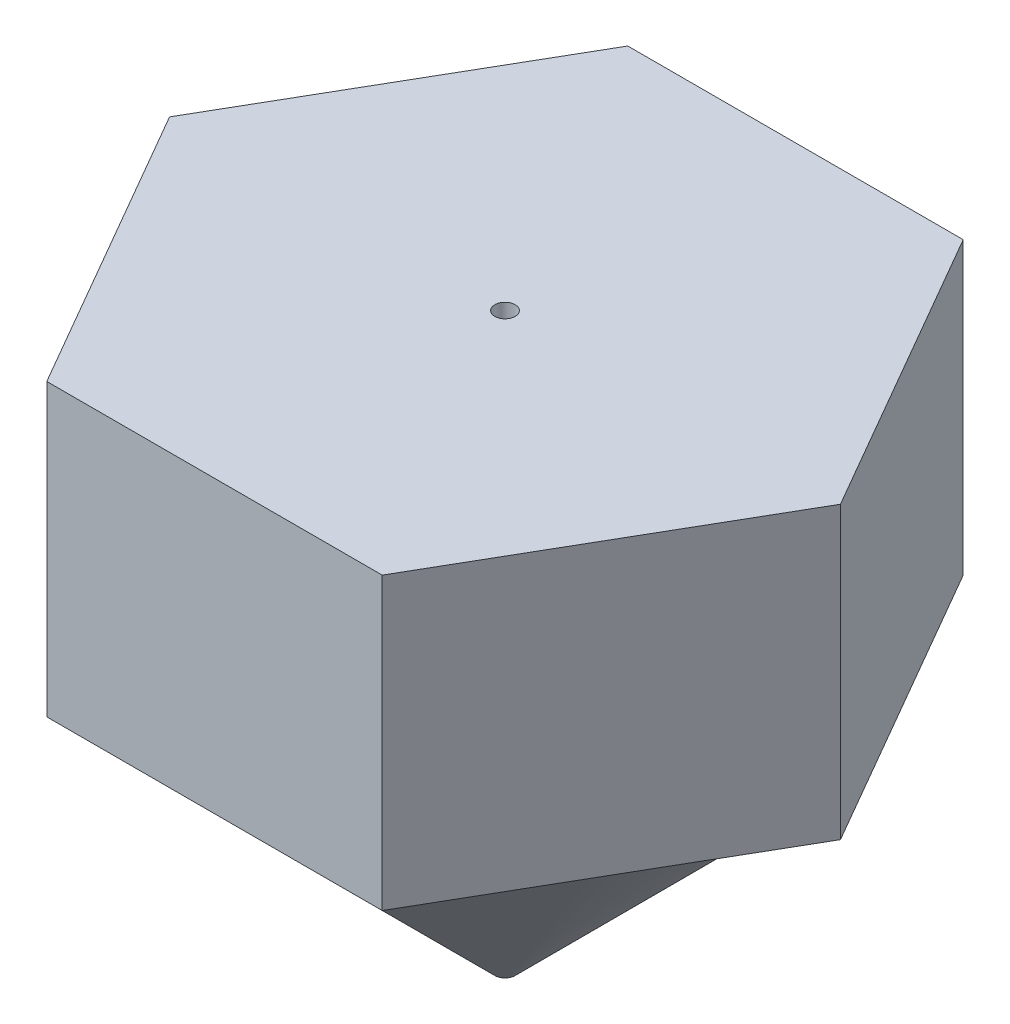
ISO-10303-21;
HEADER;
FILE_DESCRIPTION(('STEP AP214'),'2;1');
FILE_NAME('part.step','',(''),(''),'','','');
FILE_SCHEMA(('AUTOMOTIVE_DESIGN { 1 0 10303 214 1 1 1 1 }'));
ENDSEC;
DATA;
#1=APPLICATION_CONTEXT('core data for automotive mechanical design processes');
#2=APPLICATION_PROTOCOL_DEFINITION('international standard','automotive_design',2000,#1);
#3=PRODUCT_CONTEXT('',#1,'mechanical');
#4=PRODUCT('Part','Part','',(#3));
#5=PRODUCT_RELATED_PRODUCT_CATEGORY('part','',(#4));
#6=PRODUCT_DEFINITION_FORMATION('','',#4);
#7=PRODUCT_DEFINITION_CONTEXT('part definition',#1,'design');
#8=PRODUCT_DEFINITION('design','',#6,#7);
#9=PRODUCT_DEFINITION_SHAPE('','',#8);
#10=(LENGTH_UNIT() NAMED_UNIT(*) SI_UNIT(.MILLI.,.METRE.));
#11=(NAMED_UNIT(*) PLANE_ANGLE_UNIT() SI_UNIT($,.RADIAN.));
#12=(NAMED_UNIT(*) SI_UNIT($,.STERADIAN.) SOLID_ANGLE_UNIT());
#13=UNCERTAINTY_MEASURE_WITH_UNIT(LENGTH_MEASURE(1.E-05),#10,'distance_accuracy_value','');
#14=(GEOMETRIC_REPRESENTATION_CONTEXT(3) GLOBAL_UNCERTAINTY_ASSIGNED_CONTEXT((#13)) GLOBAL_UNIT_ASSIGNED_CONTEXT((#10,
#11,#12)) REPRESENTATION_CONTEXT('',''));
#15=CARTESIAN_POINT('',(0.,0.,0.));
#16=DIRECTION('',(0.,0.,1.));
#17=DIRECTION('',(1.,0.,0.));
#18=AXIS2_PLACEMENT_3D('',#15,#16,#17);
#19=CARTESIAN_POINT('',(0.,-5.,0.));
#20=DIRECTION('',(0.,1.,0.));
#21=DIRECTION('',(0.,0.,1.));
#22=AXIS2_PLACEMENT_3D('',#19,#20,#21);
#23=PLANE('',#22);
#24=DIRECTION('',(1.,0.,0.));
#25=VECTOR('',#24,1.);
#26=CARTESIAN_POINT('',(-2.88675134594814,-5.,5.00000000000002));
#27=LINE('',#26,#25);
#28=CARTESIAN_POINT('',(0.,-5.,5.00000000000002));
#29=VERTEX_POINT('',#28);
#30=CARTESIAN_POINT('',(2.88675134594812,-5.,5.00000000000002));
#31=VERTEX_POINT('',#30);
#32=EDGE_CURVE('E59',#29,#31,#27,.T.);
#33=ORIENTED_EDGE('',*,*,#32,.F.);
#34=CARTESIAN_POINT('',(0.,-5.,0.));
#35=DIRECTION('',(0.,1.,0.));
#36=DIRECTION('',(0.,0.,1.));
#37=AXIS2_PLACEMENT_3D('',#34,#35,#36);
#38=CIRCLE('',#37,4.99999999999995);
#39=CARTESIAN_POINT('',(4.33012701892215,-5.,2.49999999999997));
#40=VERTEX_POINT('',#39);
#41=EDGE_CURVE('E11',#29,#40,#38,.T.);
#42=ORIENTED_EDGE('',*,*,#41,.T.);
#43=DIRECTION('',(0.5,0.,-0.866025403784439));
#44=VECTOR('',#43,1.);
#45=CARTESIAN_POINT('',(2.88675134594812,-5.,5.00000000000002));
#46=LINE('',#45,#44);
#47=EDGE_CURVE('E179',#31,#40,#46,.T.);
#48=ORIENTED_EDGE('',*,*,#47,.F.);
#49=EDGE_LOOP('',(#33,#42,#48));
#50=FACE_BOUND('',#49,.T.);
#51=ADVANCED_FACE('F35',(#50),#23,.F.);
#52=CARTESIAN_POINT('',(5.77350269189626,-5.,0.));
#53=VERTEX_POINT('',#52);
#54=EDGE_CURVE('E92',#40,#53,#46,.T.);
#55=ORIENTED_EDGE('',*,*,#54,.F.);
#56=CARTESIAN_POINT('',(4.33012701892215,-5.,-2.49999999999998));
#57=VERTEX_POINT('',#56);
#58=EDGE_CURVE('E44',#40,#57,#38,.T.);
#59=ORIENTED_EDGE('',*,*,#58,.T.);
#60=DIRECTION('',(-0.5,0.,-0.866025403784438));
#61=VECTOR('',#60,1.);
#62=CARTESIAN_POINT('',(5.77350269189626,-5.,0.));
#63=LINE('',#62,#61);
#64=EDGE_CURVE('E182',#53,#57,#63,.T.);
#65=ORIENTED_EDGE('',*,*,#64,.F.);
#66=EDGE_LOOP('',(#55,#59,#65));
#67=FACE_BOUND('',#66,.T.);
#68=ADVANCED_FACE('F205',(#67),#23,.F.);
#69=CARTESIAN_POINT('',(2.88675134594812,-5.,-5.00000000000003));
#70=VERTEX_POINT('',#69);
#71=EDGE_CURVE('E180',#57,#70,#63,.T.);
#72=ORIENTED_EDGE('',*,*,#71,.F.);
#73=CARTESIAN_POINT('',(0.,-5.,-4.99999999999995));
#74=VERTEX_POINT('',#73);
#75=EDGE_CURVE('E199',#57,#74,#38,.T.);
#76=ORIENTED_EDGE('',*,*,#75,.T.);
#77=DIRECTION('',(-1.,0.,0.));
#78=VECTOR('',#77,1.);
#79=CARTESIAN_POINT('',(2.88675134594812,-5.,-5.00000000000003));
#80=LINE('',#79,#78);
#81=EDGE_CURVE('E117',#70,#74,#80,.T.);
#82=ORIENTED_EDGE('',*,*,#81,.F.);
#83=EDGE_LOOP('',(#72,#76,#82));
#84=FACE_BOUND('',#83,.T.);
#85=ADVANCED_FACE('F207',(#84),#23,.F.);
#86=CARTESIAN_POINT('',(-2.88675134594814,-5.,-5.00000000000003));
#87=VERTEX_POINT('',#86);
#88=EDGE_CURVE('E185',#74,#87,#80,.T.);
#89=ORIENTED_EDGE('',*,*,#88,.F.);
#90=CARTESIAN_POINT('',(-4.33012701892215,-5.,-2.49999999999997));
#91=VERTEX_POINT('',#90);
#92=EDGE_CURVE('E196',#74,#91,#38,.T.);
#93=ORIENTED_EDGE('',*,*,#92,.T.);
#94=DIRECTION('',(-0.5,0.,0.866025403784439));
#95=VECTOR('',#94,1.);
#96=CARTESIAN_POINT('',(-2.88675134594814,-5.,-5.00000000000003));
#97=LINE('',#96,#95);
#98=EDGE_CURVE('E113',#87,#91,#97,.T.);
#99=ORIENTED_EDGE('',*,*,#98,.F.);
#100=EDGE_LOOP('',(#89,#93,#99));
#101=FACE_BOUND('',#100,.T.);
#102=ADVANCED_FACE('F194',(#101),#23,.F.);
#103=CARTESIAN_POINT('',(-5.77350269189628,-5.,0.));
#104=VERTEX_POINT('',#103);
#105=EDGE_CURVE('E105',#91,#104,#97,.T.);
#106=ORIENTED_EDGE('',*,*,#105,.F.);
#107=CARTESIAN_POINT('',(-4.33012701892215,-5.,2.49999999999997));
#108=VERTEX_POINT('',#107);
#109=EDGE_CURVE('E45',#91,#108,#38,.T.);
#110=ORIENTED_EDGE('',*,*,#109,.T.);
#111=DIRECTION('',(0.5,0.,0.866025403784439));
#112=VECTOR('',#111,1.);
#113=CARTESIAN_POINT('',(-5.77350269189628,-5.,0.));
#114=LINE('',#113,#112);
#115=EDGE_CURVE('E123',#104,#108,#114,.T.);
#116=ORIENTED_EDGE('',*,*,#115,.F.);
#117=EDGE_LOOP('',(#106,#110,#116));
#118=FACE_BOUND('',#117,.T.);
#119=ADVANCED_FACE('F130',(#118),#23,.F.);
#120=CARTESIAN_POINT('',(2.88675134594812,-5.,5.00000000000002));
#121=DIRECTION('',(0.866025403784439,0.,0.5));
#122=DIRECTION('',(0.5,0.,-0.866025403784439));
#123=AXIS2_PLACEMENT_3D('',#120,#121,#122);
#124=PLANE('',#123);
#125=DIRECTION('',(0.5,0.,-0.866025403784439));
#126=VECTOR('',#125,1.);
#127=CARTESIAN_POINT('',(2.88675134594812,0.,5.00000000000002));
#128=LINE('',#127,#126);
#129=CARTESIAN_POINT('',(2.88675134594812,0.,5.00000000000002));
#130=VERTEX_POINT('',#129);
#131=CARTESIAN_POINT('',(5.77350269189626,0.,0.));
#132=VERTEX_POINT('',#131);
#133=EDGE_CURVE('E140',#130,#132,#128,.T.);
#134=ORIENTED_EDGE('',*,*,#133,.F.);
#135=DIRECTION('',(0.,1.,0.));
#136=VECTOR('',#135,1.);
#137=CARTESIAN_POINT('',(2.88675134594812,-5.,5.00000000000002));
#138=LINE('',#137,#136);
#139=EDGE_CURVE('E84',#31,#130,#138,.T.);
#140=ORIENTED_EDGE('',*,*,#139,.F.);
#141=ORIENTED_EDGE('',*,*,#47,.T.);
#142=ORIENTED_EDGE('',*,*,#54,.T.);
#143=DIRECTION('',(0.,1.,0.));
#144=VECTOR('',#143,1.);
#145=CARTESIAN_POINT('',(5.77350269189626,-5.,0.));
#146=LINE('',#145,#144);
#147=EDGE_CURVE('E139',#53,#132,#146,.T.);
#148=ORIENTED_EDGE('',*,*,#147,.T.);
#149=EDGE_LOOP('',(#134,#140,#141,#142,#148));
#150=FACE_BOUND('',#149,.T.);
#151=ADVANCED_FACE('F37',(#150),#124,.T.);
#152=CARTESIAN_POINT('',(-2.88675134594814,-5.,5.00000000000002));
#153=DIRECTION('',(0.,0.,1.));
#154=DIRECTION('',(1.,0.,0.));
#155=AXIS2_PLACEMENT_3D('',#152,#153,#154);
#156=PLANE('',#155);
#157=DIRECTION('',(1.,0.,0.));
#158=VECTOR('',#157,1.);
#159=CARTESIAN_POINT('',(-2.88675134594814,0.,5.00000000000002));
#160=LINE('',#159,#158);
#161=CARTESIAN_POINT('',(-2.88675134594814,0.,5.00000000000002));
#162=VERTEX_POINT('',#161);
#163=EDGE_CURVE('E153',#162,#130,#160,.T.);
#164=ORIENTED_EDGE('',*,*,#163,.F.);
#165=DIRECTION('',(0.,1.,0.));
#166=VECTOR('',#165,1.);
#167=CARTESIAN_POINT('',(-2.88675134594814,-5.,5.00000000000002));
#168=LINE('',#167,#166);
#169=CARTESIAN_POINT('',(-2.88675134594814,-5.,5.00000000000002));
#170=VERTEX_POINT('',#169);
#171=EDGE_CURVE('E127',#170,#162,#168,.T.);
#172=ORIENTED_EDGE('',*,*,#171,.F.);
#173=EDGE_CURVE('E135',#170,#29,#27,.T.);
#174=ORIENTED_EDGE('',*,*,#173,.T.);
#175=ORIENTED_EDGE('',*,*,#32,.T.);
#176=ORIENTED_EDGE('',*,*,#139,.T.);
#177=EDGE_LOOP('',(#164,#172,#174,#175,#176));
#178=FACE_BOUND('',#177,.T.);
#179=ADVANCED_FACE('F171',(#178),#156,.T.);
#180=CARTESIAN_POINT('',(-5.77350269189628,-5.,0.));
#181=DIRECTION('',(-0.866025403784439,0.,0.5));
#182=DIRECTION('',(0.5,0.,0.866025403784439));
#183=AXIS2_PLACEMENT_3D('',#180,#181,#182);
#184=PLANE('',#183);
#185=DIRECTION('',(0.5,0.,0.866025403784439));
#186=VECTOR('',#185,1.);
#187=CARTESIAN_POINT('',(-5.77350269189628,0.,0.));
#188=LINE('',#187,#186);
#189=CARTESIAN_POINT('',(-5.77350269189628,0.,0.));
#190=VERTEX_POINT('',#189);
#191=EDGE_CURVE('E125',#190,#162,#188,.T.);
#192=ORIENTED_EDGE('',*,*,#191,.F.);
#193=DIRECTION('',(0.,1.,0.));
#194=VECTOR('',#193,1.);
#195=CARTESIAN_POINT('',(-5.77350269189628,-5.,0.));
#196=LINE('',#195,#194);
#197=EDGE_CURVE('E109',#104,#190,#196,.T.);
#198=ORIENTED_EDGE('',*,*,#197,.F.);
#199=ORIENTED_EDGE('',*,*,#115,.T.);
#200=EDGE_CURVE('E133',#108,#170,#114,.T.);
#201=ORIENTED_EDGE('',*,*,#200,.T.);
#202=ORIENTED_EDGE('',*,*,#171,.T.);
#203=EDGE_LOOP('',(#192,#198,#199,#201,#202));
#204=FACE_BOUND('',#203,.T.);
#205=ADVANCED_FACE('F121',(#204),#184,.T.);
#206=CARTESIAN_POINT('',(-2.88675134594814,-5.,-5.00000000000003));
#207=DIRECTION('',(-0.866025403784439,0.,-0.5));
#208=DIRECTION('',(-0.5,0.,0.866025403784439));
#209=AXIS2_PLACEMENT_3D('',#206,#207,#208);
#210=PLANE('',#209);
#211=DIRECTION('',(-0.5,0.,0.866025403784439));
#212=VECTOR('',#211,1.);
#213=CARTESIAN_POINT('',(-2.88675134594814,0.,-5.00000000000003));
#214=LINE('',#213,#212);
#215=CARTESIAN_POINT('',(-2.88675134594814,0.,-5.00000000000003));
#216=VERTEX_POINT('',#215);
#217=EDGE_CURVE('E150',#216,#190,#214,.T.);
#218=ORIENTED_EDGE('',*,*,#217,.F.);
#219=DIRECTION('',(0.,1.,0.));
#220=VECTOR('',#219,1.);
#221=CARTESIAN_POINT('',(-2.88675134594814,-5.,-5.00000000000003));
#222=LINE('',#221,#220);
#223=EDGE_CURVE('E128',#87,#216,#222,.T.);
#224=ORIENTED_EDGE('',*,*,#223,.F.);
#225=ORIENTED_EDGE('',*,*,#98,.T.);
#226=ORIENTED_EDGE('',*,*,#105,.T.);
#227=ORIENTED_EDGE('',*,*,#197,.T.);
#228=EDGE_LOOP('',(#218,#224,#225,#226,#227));
#229=FACE_BOUND('',#228,.T.);
#230=ADVANCED_FACE('F108',(#229),#210,.T.);
#231=CARTESIAN_POINT('',(2.88675134594812,-5.,-5.00000000000003));
#232=DIRECTION('',(0.,0.,-1.));
#233=DIRECTION('',(-1.,0.,0.));
#234=AXIS2_PLACEMENT_3D('',#231,#232,#233);
#235=PLANE('',#234);
#236=DIRECTION('',(-1.,0.,0.));
#237=VECTOR('',#236,1.);
#238=CARTESIAN_POINT('',(2.88675134594812,0.,-5.00000000000003));
#239=LINE('',#238,#237);
#240=CARTESIAN_POINT('',(2.88675134594812,0.,-5.00000000000003));
#241=VERTEX_POINT('',#240);
#242=EDGE_CURVE('E147',#241,#216,#239,.T.);
#243=ORIENTED_EDGE('',*,*,#242,.F.);
#244=DIRECTION('',(0.,1.,0.));
#245=VECTOR('',#244,1.);
#246=CARTESIAN_POINT('',(2.88675134594812,-5.,-5.00000000000003));
#247=LINE('',#246,#245);
#248=EDGE_CURVE('E159',#70,#241,#247,.T.);
#249=ORIENTED_EDGE('',*,*,#248,.F.);
#250=ORIENTED_EDGE('',*,*,#81,.T.);
#251=ORIENTED_EDGE('',*,*,#88,.T.);
#252=ORIENTED_EDGE('',*,*,#223,.T.);
#253=EDGE_LOOP('',(#243,#249,#250,#251,#252));
#254=FACE_BOUND('',#253,.T.);
#255=ADVANCED_FACE('F191',(#254),#235,.T.);
#256=CARTESIAN_POINT('',(5.77350269189626,-5.,0.));
#257=DIRECTION('',(0.866025403784438,0.,-0.5));
#258=DIRECTION('',(-0.5,0.,-0.866025403784438));
#259=AXIS2_PLACEMENT_3D('',#256,#257,#258);
#260=PLANE('',#259);
#261=DIRECTION('',(-0.5,0.,-0.866025403784438));
#262=VECTOR('',#261,1.);
#263=CARTESIAN_POINT('',(5.77350269189626,0.,0.));
#264=LINE('',#263,#262);
#265=EDGE_CURVE('E143',#132,#241,#264,.T.);
#266=ORIENTED_EDGE('',*,*,#265,.F.);
#267=ORIENTED_EDGE('',*,*,#147,.F.);
#268=ORIENTED_EDGE('',*,*,#64,.T.);
#269=ORIENTED_EDGE('',*,*,#71,.T.);
#270=ORIENTED_EDGE('',*,*,#248,.T.);
#271=EDGE_LOOP('',(#266,#267,#268,#269,#270));
#272=FACE_BOUND('',#271,.T.);
#273=ADVANCED_FACE('F165',(#272),#260,.T.);
#274=ORIENTED_EDGE('',*,*,#200,.F.);
#275=CARTESIAN_POINT('',(0.,-5.,0.));
#276=DIRECTION('',(0.,1.,0.));
#277=DIRECTION('',(-1.,0.,0.));
#278=AXIS2_PLACEMENT_3D('',#275,#276,#277);
#279=CIRCLE('',#278,4.99999999999995);
#280=EDGE_CURVE('E144',#108,#29,#279,.T.);
#281=ORIENTED_EDGE('',*,*,#280,.T.);
#282=ORIENTED_EDGE('',*,*,#173,.F.);
#283=EDGE_LOOP('',(#274,#281,#282));
#284=FACE_BOUND('',#283,.T.);
#285=ADVANCED_FACE('F174',(#284),#23,.F.);
#286=CARTESIAN_POINT('',(0.,0.,0.));
#287=DIRECTION('',(0.,1.,0.));
#288=DIRECTION('',(0.,0.,1.));
#289=AXIS2_PLACEMENT_3D('',#286,#287,#288);
#290=PLANE('',#289);
#291=CARTESIAN_POINT('',(0.,0.,0.));
#292=DIRECTION('',(0.,1.,0.));
#293=DIRECTION('',(0.,0.,1.));
#294=AXIS2_PLACEMENT_3D('',#291,#292,#293);
#295=CIRCLE('',#294,0.175);
#296=CARTESIAN_POINT('',(0.,0.,0.175));
#297=VERTEX_POINT('',#296);
#298=EDGE_CURVE('E289',#297,#297,#295,.T.);
#299=ORIENTED_EDGE('',*,*,#298,.F.);
#300=EDGE_LOOP('',(#299));
#301=FACE_BOUND('',#300,.T.);
#302=ORIENTED_EDGE('',*,*,#133,.T.);
#303=ORIENTED_EDGE('',*,*,#265,.T.);
#304=ORIENTED_EDGE('',*,*,#242,.T.);
#305=ORIENTED_EDGE('',*,*,#217,.T.);
#306=ORIENTED_EDGE('',*,*,#191,.T.);
#307=ORIENTED_EDGE('',*,*,#163,.T.);
#308=EDGE_LOOP('',(#302,#303,#304,#305,#306,#307));
#309=FACE_BOUND('',#308,.T.);
#310=ADVANCED_FACE('F169',(#301,#309),#290,.T.);
#311=CARTESIAN_POINT('',(0.,-5.,0.));
#312=DIRECTION('',(0.,1.,0.));
#313=DIRECTION('',(-1.,0.,0.));
#314=AXIS2_PLACEMENT_3D('',#311,#312,#313);
#315=CONICAL_SURFACE('',#314,4.99999999999995,0.785398163397443);
#316=CARTESIAN_POINT('',(0.,-9.825,0.));
#317=DIRECTION('',(0.,1.,0.));
#318=DIRECTION('',(-1.,0.,0.));
#319=AXIS2_PLACEMENT_3D('',#316,#317,#318);
#320=CIRCLE('',#319,0.175);
#321=CARTESIAN_POINT('',(-0.174999999999999,-9.825,0.));
#322=VERTEX_POINT('',#321);
#323=EDGE_CURVE('E39',#322,#322,#320,.F.);
#324=ORIENTED_EDGE('',*,*,#323,.F.);
#325=EDGE_LOOP('',(#324));
#326=FACE_BOUND('',#325,.T.);
#327=ORIENTED_EDGE('',*,*,#280,.F.);
#328=ORIENTED_EDGE('',*,*,#109,.F.);
#329=ORIENTED_EDGE('',*,*,#92,.F.);
#330=ORIENTED_EDGE('',*,*,#75,.F.);
#331=ORIENTED_EDGE('',*,*,#58,.F.);
#332=ORIENTED_EDGE('',*,*,#41,.F.);
#333=EDGE_LOOP('',(#327,#328,#329,#330,#331,#332));
#334=FACE_BOUND('',#333,.T.);
#335=ADVANCED_FACE('F224',(#326,#334),#315,.T.);
#336=CARTESIAN_POINT('',(0.,-10.,0.));
#337=DIRECTION('',(0.,1.,0.));
#338=DIRECTION('',(0.,0.,1.));
#339=AXIS2_PLACEMENT_3D('',#336,#337,#338);
#340=CYLINDRICAL_SURFACE('',#339,0.175);
#341=ORIENTED_EDGE('',*,*,#323,.T.);
#342=EDGE_LOOP('',(#341));
#343=FACE_BOUND('',#342,.T.);
#344=ORIENTED_EDGE('',*,*,#298,.T.);
#345=EDGE_LOOP('',(#344));
#346=FACE_BOUND('',#345,.T.);
#347=ADVANCED_FACE('F270',(#343,#346),#340,.F.);
#348=CLOSED_SHELL('',(#51,#68,#85,#102,#119,#151,#179,#205,#230,#255,#273,#285,#310,#335,#347));
#349=MANIFOLD_SOLID_BREP('B2',#348);
#350=ADVANCED_BREP_SHAPE_REPRESENTATION('',(#18,#349),#14);
#351=SHAPE_DEFINITION_REPRESENTATION(#9,#350);
ENDSEC;
END-ISO-10303-21;
